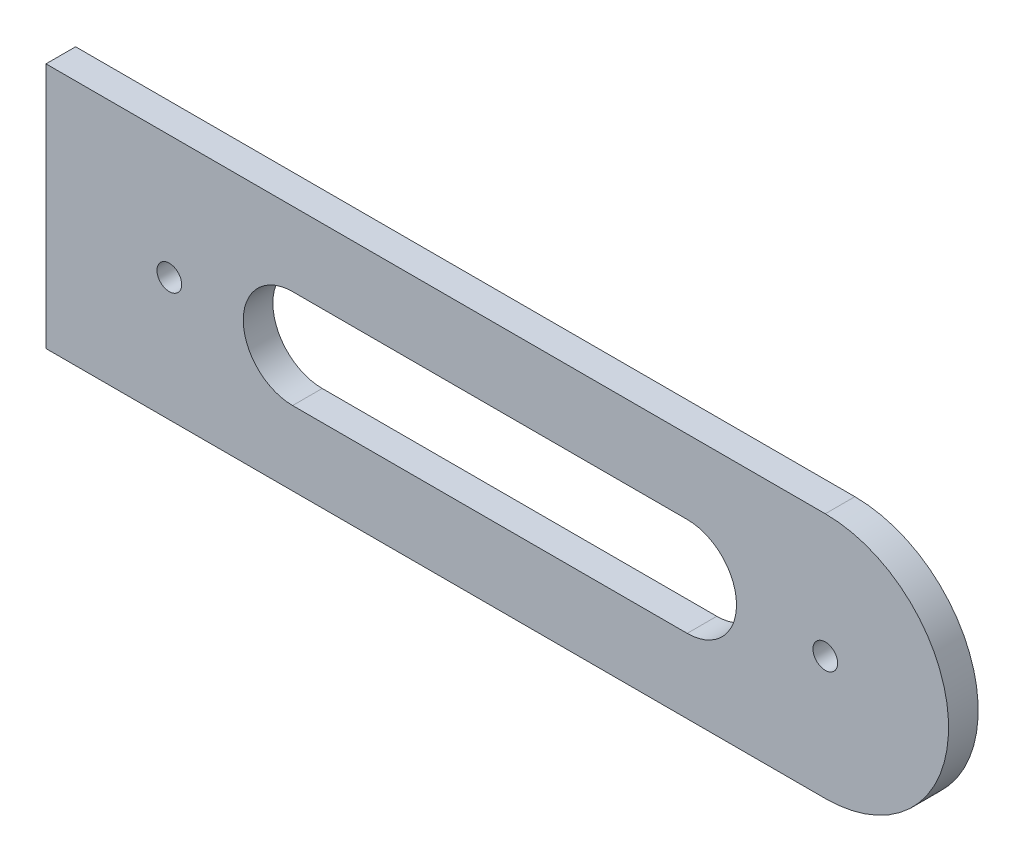
ISO-10303-21;
HEADER;
FILE_DESCRIPTION(('STEP AP214'),'2;1');
FILE_NAME('part.step','',(''),(''),'','','');
FILE_SCHEMA(('AUTOMOTIVE_DESIGN { 1 0 10303 214 1 1 1 1 }'));
ENDSEC;
DATA;
#1=APPLICATION_CONTEXT('core data for automotive mechanical design processes');
#2=APPLICATION_PROTOCOL_DEFINITION('international standard','automotive_design',2000,#1);
#3=PRODUCT_CONTEXT('',#1,'mechanical');
#4=PRODUCT('Part','Part','',(#3));
#5=PRODUCT_RELATED_PRODUCT_CATEGORY('part','',(#4));
#6=PRODUCT_DEFINITION_FORMATION('','',#4);
#7=PRODUCT_DEFINITION_CONTEXT('part definition',#1,'design');
#8=PRODUCT_DEFINITION('design','',#6,#7);
#9=PRODUCT_DEFINITION_SHAPE('','',#8);
#10=(LENGTH_UNIT() NAMED_UNIT(*) SI_UNIT(.MILLI.,.METRE.));
#11=(NAMED_UNIT(*) PLANE_ANGLE_UNIT() SI_UNIT($,.RADIAN.));
#12=(NAMED_UNIT(*) SI_UNIT($,.STERADIAN.) SOLID_ANGLE_UNIT());
#13=UNCERTAINTY_MEASURE_WITH_UNIT(LENGTH_MEASURE(1.E-05),#10,'distance_accuracy_value','');
#14=(GEOMETRIC_REPRESENTATION_CONTEXT(3) GLOBAL_UNCERTAINTY_ASSIGNED_CONTEXT((#13)) GLOBAL_UNIT_ASSIGNED_CONTEXT((#10,
#11,#12)) REPRESENTATION_CONTEXT('',''));
#15=CARTESIAN_POINT('',(0.,0.,0.));
#16=DIRECTION('',(0.,0.,1.));
#17=DIRECTION('',(1.,0.,0.));
#18=AXIS2_PLACEMENT_3D('',#15,#16,#17);
#19=CARTESIAN_POINT('',(158.,-25.,6.));
#20=DIRECTION('',(0.,0.,1.));
#21=DIRECTION('',(1.,0.,0.));
#22=AXIS2_PLACEMENT_3D('',#19,#20,#21);
#23=PLANE('',#22);
#24=CARTESIAN_POINT('',(25.,-25.,6.));
#25=DIRECTION('',(0.,0.,1.));
#26=DIRECTION('',(1.,0.,0.));
#27=AXIS2_PLACEMENT_3D('',#24,#25,#26);
#28=CIRCLE('',#27,2.50000000000002);
#29=CARTESIAN_POINT('',(27.5,-25.,6.));
#30=VERTEX_POINT('',#29);
#31=EDGE_CURVE('E140',#30,#30,#28,.T.);
#32=ORIENTED_EDGE('',*,*,#31,.F.);
#33=EDGE_LOOP('',(#32));
#34=FACE_BOUND('',#33,.T.);
#35=DIRECTION('',(0.,-1.,0.));
#36=VECTOR('',#35,1.);
#37=CARTESIAN_POINT('',(0.,0.,6.));
#38=LINE('',#37,#36);
#39=CARTESIAN_POINT('',(0.,0.,6.));
#40=VERTEX_POINT('',#39);
#41=CARTESIAN_POINT('',(0.,-50.,6.));
#42=VERTEX_POINT('',#41);
#43=EDGE_CURVE('E156',#40,#42,#38,.T.);
#44=ORIENTED_EDGE('',*,*,#43,.T.);
#45=DIRECTION('',(1.,0.,0.));
#46=VECTOR('',#45,1.);
#47=CARTESIAN_POINT('',(0.,-50.,6.));
#48=LINE('',#47,#46);
#49=CARTESIAN_POINT('',(158.,-50.,6.));
#50=VERTEX_POINT('',#49);
#51=EDGE_CURVE('E160',#42,#50,#48,.T.);
#52=ORIENTED_EDGE('',*,*,#51,.T.);
#53=CARTESIAN_POINT('',(158.,-25.,6.));
#54=DIRECTION('',(0.,0.,1.));
#55=DIRECTION('',(1.,0.,0.));
#56=AXIS2_PLACEMENT_3D('',#53,#54,#55);
#57=CIRCLE('',#56,25.);
#58=CARTESIAN_POINT('',(158.,0.,6.));
#59=VERTEX_POINT('',#58);
#60=EDGE_CURVE('E164',#50,#59,#57,.T.);
#61=ORIENTED_EDGE('',*,*,#60,.T.);
#62=DIRECTION('',(-1.,0.,0.));
#63=VECTOR('',#62,1.);
#64=CARTESIAN_POINT('',(158.,0.,6.));
#65=LINE('',#64,#63);
#66=EDGE_CURVE('E167',#59,#40,#65,.T.);
#67=ORIENTED_EDGE('',*,*,#66,.T.);
#68=EDGE_LOOP('',(#44,#52,#61,#67));
#69=FACE_BOUND('',#68,.T.);
#70=DIRECTION('',(-1.,0.,0.));
#71=VECTOR('',#70,1.);
#72=CARTESIAN_POINT('',(130.,-15.,6.));
#73=LINE('',#72,#71);
#74=CARTESIAN_POINT('',(130.,-15.,6.));
#75=VERTEX_POINT('',#74);
#76=CARTESIAN_POINT('',(50.,-15.,6.));
#77=VERTEX_POINT('',#76);
#78=EDGE_CURVE('E114',#75,#77,#73,.T.);
#79=ORIENTED_EDGE('',*,*,#78,.F.);
#80=CARTESIAN_POINT('',(130.,-25.,6.));
#81=DIRECTION('',(0.,0.,1.));
#82=DIRECTION('',(1.,0.,0.));
#83=AXIS2_PLACEMENT_3D('',#80,#81,#82);
#84=CIRCLE('',#83,10.);
#85=CARTESIAN_POINT('',(130.,-35.,6.));
#86=VERTEX_POINT('',#85);
#87=EDGE_CURVE('E105',#86,#75,#84,.T.);
#88=ORIENTED_EDGE('',*,*,#87,.F.);
#89=DIRECTION('',(1.,0.,0.));
#90=VECTOR('',#89,1.);
#91=CARTESIAN_POINT('',(50.,-35.,6.));
#92=LINE('',#91,#90);
#93=CARTESIAN_POINT('',(50.,-35.,6.));
#94=VERTEX_POINT('',#93);
#95=EDGE_CURVE('E132',#94,#86,#92,.T.);
#96=ORIENTED_EDGE('',*,*,#95,.F.);
#97=CARTESIAN_POINT('',(50.,-25.,6.));
#98=DIRECTION('',(0.,0.,1.));
#99=DIRECTION('',(1.,0.,0.));
#100=AXIS2_PLACEMENT_3D('',#97,#98,#99);
#101=CIRCLE('',#100,10.);
#102=EDGE_CURVE('E128',#77,#94,#101,.T.);
#103=ORIENTED_EDGE('',*,*,#102,.F.);
#104=EDGE_LOOP('',(#79,#88,#96,#103));
#105=FACE_BOUND('',#104,.T.);
#106=CARTESIAN_POINT('',(158.,-25.,6.));
#107=DIRECTION('',(0.,0.,1.));
#108=DIRECTION('',(1.,0.,0.));
#109=AXIS2_PLACEMENT_3D('',#106,#107,#108);
#110=CIRCLE('',#109,2.5);
#111=CARTESIAN_POINT('',(160.5,-25.,6.));
#112=VERTEX_POINT('',#111);
#113=EDGE_CURVE('E257',#112,#112,#110,.T.);
#114=ORIENTED_EDGE('',*,*,#113,.F.);
#115=EDGE_LOOP('',(#114));
#116=FACE_BOUND('',#115,.T.);
#117=ADVANCED_FACE('F39',(#34,#69,#105,#116),#23,.T.);
#118=CARTESIAN_POINT('',(158.,-25.,0.));
#119=DIRECTION('',(0.,0.,1.));
#120=DIRECTION('',(1.,0.,0.));
#121=AXIS2_PLACEMENT_3D('',#118,#119,#120);
#122=PLANE('',#121);
#123=DIRECTION('',(0.,-1.,0.));
#124=VECTOR('',#123,1.);
#125=CARTESIAN_POINT('',(0.,0.,0.));
#126=LINE('',#125,#124);
#127=CARTESIAN_POINT('',(0.,0.,0.));
#128=VERTEX_POINT('',#127);
#129=CARTESIAN_POINT('',(0.,-50.,0.));
#130=VERTEX_POINT('',#129);
#131=EDGE_CURVE('E123',#128,#130,#126,.T.);
#132=ORIENTED_EDGE('',*,*,#131,.F.);
#133=DIRECTION('',(-1.,0.,0.));
#134=VECTOR('',#133,1.);
#135=CARTESIAN_POINT('',(158.,0.,0.));
#136=LINE('',#135,#134);
#137=CARTESIAN_POINT('',(158.,0.,0.));
#138=VERTEX_POINT('',#137);
#139=EDGE_CURVE('E161',#138,#128,#136,.T.);
#140=ORIENTED_EDGE('',*,*,#139,.F.);
#141=CARTESIAN_POINT('',(158.,-25.,0.));
#142=DIRECTION('',(0.,0.,1.));
#143=DIRECTION('',(1.,0.,0.));
#144=AXIS2_PLACEMENT_3D('',#141,#142,#143);
#145=CIRCLE('',#144,25.);
#146=CARTESIAN_POINT('',(158.,-50.,0.));
#147=VERTEX_POINT('',#146);
#148=EDGE_CURVE('E177',#147,#138,#145,.T.);
#149=ORIENTED_EDGE('',*,*,#148,.F.);
#150=DIRECTION('',(1.,0.,0.));
#151=VECTOR('',#150,1.);
#152=CARTESIAN_POINT('',(0.,-50.,0.));
#153=LINE('',#152,#151);
#154=EDGE_CURVE('E174',#130,#147,#153,.T.);
#155=ORIENTED_EDGE('',*,*,#154,.F.);
#156=EDGE_LOOP('',(#132,#140,#149,#155));
#157=FACE_BOUND('',#156,.T.);
#158=CARTESIAN_POINT('',(130.,-25.,0.));
#159=DIRECTION('',(0.,0.,1.));
#160=DIRECTION('',(1.,0.,0.));
#161=AXIS2_PLACEMENT_3D('',#158,#159,#160);
#162=CIRCLE('',#161,10.);
#163=CARTESIAN_POINT('',(130.,-35.,0.));
#164=VERTEX_POINT('',#163);
#165=CARTESIAN_POINT('',(130.,-15.,0.));
#166=VERTEX_POINT('',#165);
#167=EDGE_CURVE('E63',#164,#166,#162,.T.);
#168=ORIENTED_EDGE('',*,*,#167,.T.);
#169=DIRECTION('',(-1.,0.,0.));
#170=VECTOR('',#169,1.);
#171=CARTESIAN_POINT('',(130.,-15.,0.));
#172=LINE('',#171,#170);
#173=CARTESIAN_POINT('',(50.,-15.,0.));
#174=VERTEX_POINT('',#173);
#175=EDGE_CURVE('E121',#166,#174,#172,.T.);
#176=ORIENTED_EDGE('',*,*,#175,.T.);
#177=CARTESIAN_POINT('',(50.,-25.,0.));
#178=DIRECTION('',(0.,0.,1.));
#179=DIRECTION('',(1.,0.,0.));
#180=AXIS2_PLACEMENT_3D('',#177,#178,#179);
#181=CIRCLE('',#180,10.);
#182=CARTESIAN_POINT('',(50.,-35.,0.));
#183=VERTEX_POINT('',#182);
#184=EDGE_CURVE('E143',#174,#183,#181,.T.);
#185=ORIENTED_EDGE('',*,*,#184,.T.);
#186=DIRECTION('',(1.,0.,0.));
#187=VECTOR('',#186,1.);
#188=CARTESIAN_POINT('',(50.,-35.,0.));
#189=LINE('',#188,#187);
#190=EDGE_CURVE('E115',#183,#164,#189,.T.);
#191=ORIENTED_EDGE('',*,*,#190,.T.);
#192=EDGE_LOOP('',(#168,#176,#185,#191));
#193=FACE_BOUND('',#192,.T.);
#194=CARTESIAN_POINT('',(25.,-25.,0.));
#195=DIRECTION('',(0.,0.,1.));
#196=DIRECTION('',(1.,0.,0.));
#197=AXIS2_PLACEMENT_3D('',#194,#195,#196);
#198=CIRCLE('',#197,2.50000000000002);
#199=CARTESIAN_POINT('',(27.5,-25.,0.));
#200=VERTEX_POINT('',#199);
#201=EDGE_CURVE('E265',#200,#200,#198,.T.);
#202=ORIENTED_EDGE('',*,*,#201,.T.);
#203=EDGE_LOOP('',(#202));
#204=FACE_BOUND('',#203,.T.);
#205=CARTESIAN_POINT('',(158.,-25.,0.));
#206=DIRECTION('',(0.,0.,1.));
#207=DIRECTION('',(1.,0.,0.));
#208=AXIS2_PLACEMENT_3D('',#205,#206,#207);
#209=CIRCLE('',#208,2.5);
#210=CARTESIAN_POINT('',(160.5,-25.,0.));
#211=VERTEX_POINT('',#210);
#212=EDGE_CURVE('E260',#211,#211,#209,.T.);
#213=ORIENTED_EDGE('',*,*,#212,.T.);
#214=EDGE_LOOP('',(#213));
#215=FACE_BOUND('',#214,.T.);
#216=ADVANCED_FACE('F200',(#157,#193,#204,#215),#122,.F.);
#217=CARTESIAN_POINT('',(0.,0.,6.));
#218=DIRECTION('',(1.,0.,0.));
#219=DIRECTION('',(0.,0.,-1.));
#220=AXIS2_PLACEMENT_3D('',#217,#218,#219);
#221=PLANE('',#220);
#222=ORIENTED_EDGE('',*,*,#131,.T.);
#223=DIRECTION('',(0.,0.,-1.));
#224=VECTOR('',#223,1.);
#225=CARTESIAN_POINT('',(0.,-50.,6.));
#226=LINE('',#225,#224);
#227=EDGE_CURVE('E11',#42,#130,#226,.T.);
#228=ORIENTED_EDGE('',*,*,#227,.F.);
#229=ORIENTED_EDGE('',*,*,#43,.F.);
#230=DIRECTION('',(0.,0.,-1.));
#231=VECTOR('',#230,1.);
#232=CARTESIAN_POINT('',(0.,0.,6.));
#233=LINE('',#232,#231);
#234=EDGE_CURVE('E170',#40,#128,#233,.T.);
#235=ORIENTED_EDGE('',*,*,#234,.T.);
#236=EDGE_LOOP('',(#222,#228,#229,#235));
#237=FACE_BOUND('',#236,.T.);
#238=ADVANCED_FACE('F41',(#237),#221,.F.);
#239=CARTESIAN_POINT('',(0.,-50.,6.));
#240=DIRECTION('',(0.,1.,0.));
#241=DIRECTION('',(0.,0.,1.));
#242=AXIS2_PLACEMENT_3D('',#239,#240,#241);
#243=PLANE('',#242);
#244=ORIENTED_EDGE('',*,*,#154,.T.);
#245=DIRECTION('',(0.,0.,-1.));
#246=VECTOR('',#245,1.);
#247=CARTESIAN_POINT('',(158.,-50.,6.));
#248=LINE('',#247,#246);
#249=EDGE_CURVE('E48',#50,#147,#248,.T.);
#250=ORIENTED_EDGE('',*,*,#249,.F.);
#251=ORIENTED_EDGE('',*,*,#51,.F.);
#252=ORIENTED_EDGE('',*,*,#227,.T.);
#253=EDGE_LOOP('',(#244,#250,#251,#252));
#254=FACE_BOUND('',#253,.T.);
#255=ADVANCED_FACE('F210',(#254),#243,.F.);
#256=CARTESIAN_POINT('',(158.,-25.,6.));
#257=DIRECTION('',(0.,0.,-1.));
#258=DIRECTION('',(-1.,0.,0.));
#259=AXIS2_PLACEMENT_3D('',#256,#257,#258);
#260=CYLINDRICAL_SURFACE('',#259,25.);
#261=ORIENTED_EDGE('',*,*,#148,.T.);
#262=DIRECTION('',(0.,0.,-1.));
#263=VECTOR('',#262,1.);
#264=CARTESIAN_POINT('',(158.,0.,6.));
#265=LINE('',#264,#263);
#266=EDGE_CURVE('E185',#59,#138,#265,.T.);
#267=ORIENTED_EDGE('',*,*,#266,.F.);
#268=ORIENTED_EDGE('',*,*,#60,.F.);
#269=ORIENTED_EDGE('',*,*,#249,.T.);
#270=EDGE_LOOP('',(#261,#267,#268,#269));
#271=FACE_BOUND('',#270,.T.);
#272=ADVANCED_FACE('F194',(#271),#260,.T.);
#273=CARTESIAN_POINT('',(158.,0.,6.));
#274=DIRECTION('',(0.,-1.,0.));
#275=DIRECTION('',(0.,0.,-1.));
#276=AXIS2_PLACEMENT_3D('',#273,#274,#275);
#277=PLANE('',#276);
#278=ORIENTED_EDGE('',*,*,#139,.T.);
#279=ORIENTED_EDGE('',*,*,#234,.F.);
#280=ORIENTED_EDGE('',*,*,#66,.F.);
#281=ORIENTED_EDGE('',*,*,#266,.T.);
#282=EDGE_LOOP('',(#278,#279,#280,#281));
#283=FACE_BOUND('',#282,.T.);
#284=ADVANCED_FACE('F204',(#283),#277,.F.);
#285=CARTESIAN_POINT('',(130.,-25.,6.));
#286=DIRECTION('',(0.,0.,-1.));
#287=DIRECTION('',(-1.,0.,0.));
#288=AXIS2_PLACEMENT_3D('',#285,#286,#287);
#289=CYLINDRICAL_SURFACE('',#288,10.);
#290=ORIENTED_EDGE('',*,*,#167,.F.);
#291=DIRECTION('',(0.,0.,-1.));
#292=VECTOR('',#291,1.);
#293=CARTESIAN_POINT('',(130.,-35.,6.));
#294=LINE('',#293,#292);
#295=EDGE_CURVE('E109',#86,#164,#294,.T.);
#296=ORIENTED_EDGE('',*,*,#295,.F.);
#297=ORIENTED_EDGE('',*,*,#87,.T.);
#298=DIRECTION('',(0.,0.,-1.));
#299=VECTOR('',#298,1.);
#300=CARTESIAN_POINT('',(130.,-15.,6.));
#301=LINE('',#300,#299);
#302=EDGE_CURVE('E108',#75,#166,#301,.T.);
#303=ORIENTED_EDGE('',*,*,#302,.T.);
#304=EDGE_LOOP('',(#290,#296,#297,#303));
#305=FACE_BOUND('',#304,.T.);
#306=ADVANCED_FACE('F107',(#305),#289,.F.);
#307=CARTESIAN_POINT('',(130.,-15.,6.));
#308=DIRECTION('',(0.,-1.,0.));
#309=DIRECTION('',(1.,0.,0.));
#310=AXIS2_PLACEMENT_3D('',#307,#308,#309);
#311=PLANE('',#310);
#312=ORIENTED_EDGE('',*,*,#175,.F.);
#313=ORIENTED_EDGE('',*,*,#302,.F.);
#314=ORIENTED_EDGE('',*,*,#78,.T.);
#315=DIRECTION('',(0.,0.,-1.));
#316=VECTOR('',#315,1.);
#317=CARTESIAN_POINT('',(50.,-15.,6.));
#318=LINE('',#317,#316);
#319=EDGE_CURVE('E124',#77,#174,#318,.T.);
#320=ORIENTED_EDGE('',*,*,#319,.T.);
#321=EDGE_LOOP('',(#312,#313,#314,#320));
#322=FACE_BOUND('',#321,.T.);
#323=ADVANCED_FACE('F118',(#322),#311,.T.);
#324=CARTESIAN_POINT('',(50.,-25.,6.));
#325=DIRECTION('',(0.,0.,-1.));
#326=DIRECTION('',(-1.,0.,0.));
#327=AXIS2_PLACEMENT_3D('',#324,#325,#326);
#328=CYLINDRICAL_SURFACE('',#327,10.);
#329=ORIENTED_EDGE('',*,*,#184,.F.);
#330=ORIENTED_EDGE('',*,*,#319,.F.);
#331=ORIENTED_EDGE('',*,*,#102,.T.);
#332=DIRECTION('',(0.,0.,-1.));
#333=VECTOR('',#332,1.);
#334=CARTESIAN_POINT('',(50.,-35.,6.));
#335=LINE('',#334,#333);
#336=EDGE_CURVE('E55',#94,#183,#335,.T.);
#337=ORIENTED_EDGE('',*,*,#336,.T.);
#338=EDGE_LOOP('',(#329,#330,#331,#337));
#339=FACE_BOUND('',#338,.T.);
#340=ADVANCED_FACE('F235',(#339),#328,.F.);
#341=CARTESIAN_POINT('',(50.,-35.,6.));
#342=DIRECTION('',(0.,1.,0.));
#343=DIRECTION('',(-1.,0.,0.));
#344=AXIS2_PLACEMENT_3D('',#341,#342,#343);
#345=PLANE('',#344);
#346=ORIENTED_EDGE('',*,*,#190,.F.);
#347=ORIENTED_EDGE('',*,*,#336,.F.);
#348=ORIENTED_EDGE('',*,*,#95,.T.);
#349=ORIENTED_EDGE('',*,*,#295,.T.);
#350=EDGE_LOOP('',(#346,#347,#348,#349));
#351=FACE_BOUND('',#350,.T.);
#352=ADVANCED_FACE('F239',(#351),#345,.T.);
#353=CARTESIAN_POINT('',(25.,-25.,6.));
#354=DIRECTION('',(0.,0.,-1.));
#355=DIRECTION('',(-1.,0.,0.));
#356=AXIS2_PLACEMENT_3D('',#353,#354,#355);
#357=CYLINDRICAL_SURFACE('',#356,2.50000000000002);
#358=ORIENTED_EDGE('',*,*,#31,.T.);
#359=EDGE_LOOP('',(#358));
#360=FACE_BOUND('',#359,.T.);
#361=ORIENTED_EDGE('',*,*,#201,.F.);
#362=EDGE_LOOP('',(#361));
#363=FACE_BOUND('',#362,.T.);
#364=ADVANCED_FACE('F245',(#360,#363),#357,.F.);
#365=CARTESIAN_POINT('',(158.,-25.,6.));
#366=DIRECTION('',(0.,0.,-1.));
#367=DIRECTION('',(-1.,0.,0.));
#368=AXIS2_PLACEMENT_3D('',#365,#366,#367);
#369=CYLINDRICAL_SURFACE('',#368,2.5);
#370=ORIENTED_EDGE('',*,*,#113,.T.);
#371=EDGE_LOOP('',(#370));
#372=FACE_BOUND('',#371,.T.);
#373=ORIENTED_EDGE('',*,*,#212,.F.);
#374=EDGE_LOOP('',(#373));
#375=FACE_BOUND('',#374,.T.);
#376=ADVANCED_FACE('F248',(#372,#375),#369,.F.);
#377=CLOSED_SHELL('',(#117,#216,#238,#255,#272,#284,#306,#323,#340,#352,#364,#376));
#378=MANIFOLD_SOLID_BREP('B2',#377);
#379=ADVANCED_BREP_SHAPE_REPRESENTATION('',(#18,#378),#14);
#380=SHAPE_DEFINITION_REPRESENTATION(#9,#379);
ENDSEC;
END-ISO-10303-21;
